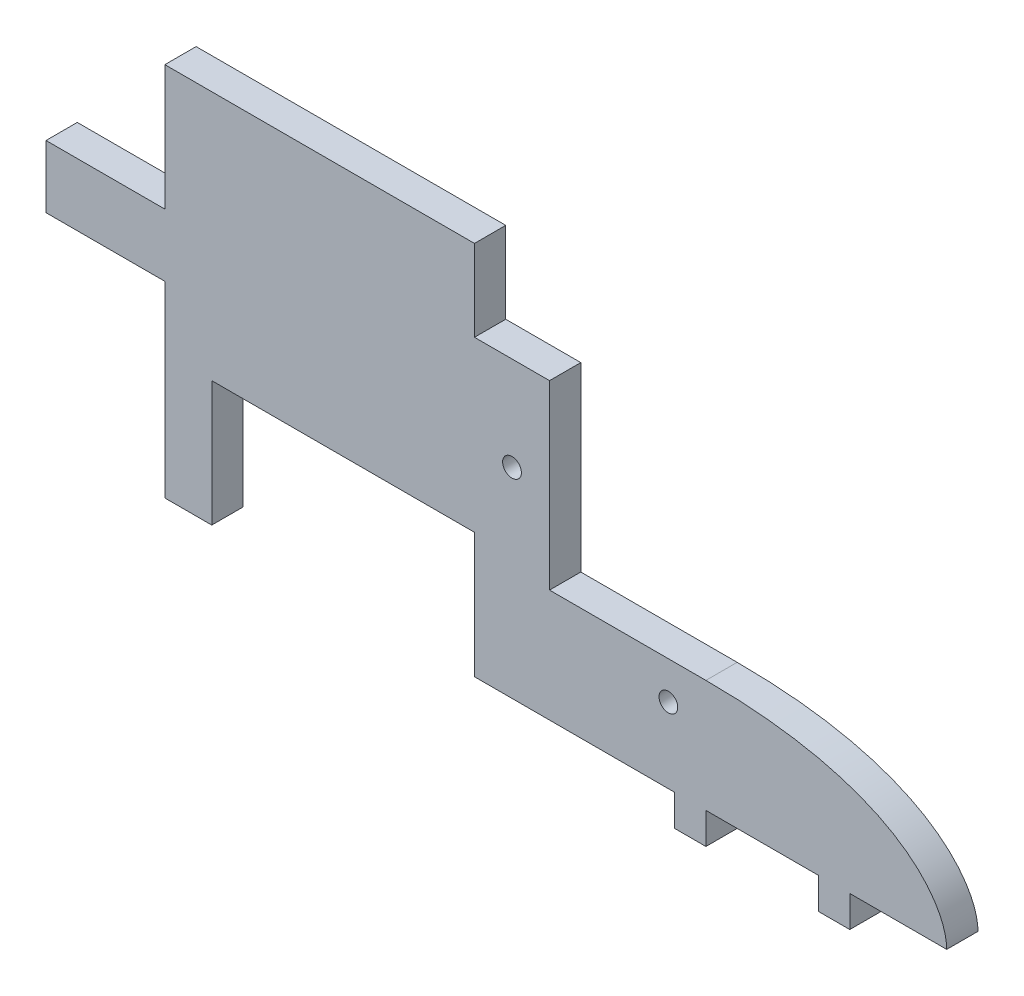
ISO-10303-21;
HEADER;
FILE_DESCRIPTION(('STEP AP214'),'2;1');
FILE_NAME('part.step','',(''),(''),'','','');
FILE_SCHEMA(('AUTOMOTIVE_DESIGN { 1 0 10303 214 1 1 1 1 }'));
ENDSEC;
DATA;
#1=APPLICATION_CONTEXT('core data for automotive mechanical design processes');
#2=APPLICATION_PROTOCOL_DEFINITION('international standard','automotive_design',2000,#1);
#3=PRODUCT_CONTEXT('',#1,'mechanical');
#4=PRODUCT('Part','Part','',(#3));
#5=PRODUCT_RELATED_PRODUCT_CATEGORY('part','',(#4));
#6=PRODUCT_DEFINITION_FORMATION('','',#4);
#7=PRODUCT_DEFINITION_CONTEXT('part definition',#1,'design');
#8=PRODUCT_DEFINITION('design','',#6,#7);
#9=PRODUCT_DEFINITION_SHAPE('','',#8);
#10=(LENGTH_UNIT() NAMED_UNIT(*) SI_UNIT(.MILLI.,.METRE.));
#11=(NAMED_UNIT(*) PLANE_ANGLE_UNIT() SI_UNIT($,.RADIAN.));
#12=(NAMED_UNIT(*) SI_UNIT($,.STERADIAN.) SOLID_ANGLE_UNIT());
#13=UNCERTAINTY_MEASURE_WITH_UNIT(LENGTH_MEASURE(1.E-05),#10,'distance_accuracy_value','');
#14=(GEOMETRIC_REPRESENTATION_CONTEXT(3) GLOBAL_UNCERTAINTY_ASSIGNED_CONTEXT((#13)) GLOBAL_UNIT_ASSIGNED_CONTEXT((#10,
#11,#12)) REPRESENTATION_CONTEXT('',''));
#15=CARTESIAN_POINT('',(0.,0.,0.));
#16=DIRECTION('',(0.,0.,1.));
#17=DIRECTION('',(1.,0.,0.));
#18=AXIS2_PLACEMENT_3D('',#15,#16,#17);
#19=CARTESIAN_POINT('',(0.,0.,5.));
#20=DIRECTION('',(0.,0.,-1.));
#21=DIRECTION('',(-1.,0.,0.));
#22=AXIS2_PLACEMENT_3D('',#19,#20,#21);
#23=PLANE('',#22);
#24=CARTESIAN_POINT('',(6.,32.,5.));
#25=DIRECTION('',(0.,0.,1.));
#26=DIRECTION('',(1.,0.,0.));
#27=AXIS2_PLACEMENT_3D('',#24,#25,#26);
#28=CIRCLE('',#27,1.5);
#29=CARTESIAN_POINT('',(7.5,32.,5.));
#30=VERTEX_POINT('',#29);
#31=EDGE_CURVE('E394',#30,#30,#28,.T.);
#32=ORIENTED_EDGE('',*,*,#31,.F.);
#33=EDGE_LOOP('',(#32));
#34=FACE_BOUND('',#33,.T.);
#35=DIRECTION('',(1.,0.,0.));
#36=VECTOR('',#35,1.);
#37=CARTESIAN_POINT('',(0.,60.,5.));
#38=LINE('',#37,#36);
#39=CARTESIAN_POINT('',(-49.5,60.,5.));
#40=VERTEX_POINT('',#39);
#41=CARTESIAN_POINT('',(0.,60.,5.));
#42=VERTEX_POINT('',#41);
#43=EDGE_CURVE('E195',#40,#42,#38,.T.);
#44=ORIENTED_EDGE('',*,*,#43,.F.);
#45=DIRECTION('',(0.,1.,0.));
#46=VECTOR('',#45,1.);
#47=CARTESIAN_POINT('',(-49.5,40.,5.));
#48=LINE('',#47,#46);
#49=CARTESIAN_POINT('',(-49.5,40.,5.));
#50=VERTEX_POINT('',#49);
#51=EDGE_CURVE('E199',#50,#40,#48,.T.);
#52=ORIENTED_EDGE('',*,*,#51,.F.);
#53=DIRECTION('',(1.,0.,0.));
#54=VECTOR('',#53,1.);
#55=CARTESIAN_POINT('',(-49.5,40.,5.));
#56=LINE('',#55,#54);
#57=CARTESIAN_POINT('',(-68.5,40.,5.));
#58=VERTEX_POINT('',#57);
#59=EDGE_CURVE('E212',#58,#50,#56,.T.);
#60=ORIENTED_EDGE('',*,*,#59,.F.);
#61=DIRECTION('',(0.,1.,0.));
#62=VECTOR('',#61,1.);
#63=CARTESIAN_POINT('',(-68.5,30.,5.));
#64=LINE('',#63,#62);
#65=CARTESIAN_POINT('',(-68.5,30.,5.));
#66=VERTEX_POINT('',#65);
#67=EDGE_CURVE('E216',#66,#58,#64,.T.);
#68=ORIENTED_EDGE('',*,*,#67,.F.);
#69=DIRECTION('',(-1.,0.,0.));
#70=VECTOR('',#69,1.);
#71=CARTESIAN_POINT('',(-49.5,30.,5.));
#72=LINE('',#71,#70);
#73=CARTESIAN_POINT('',(-49.5,30.,5.));
#74=VERTEX_POINT('',#73);
#75=EDGE_CURVE('E424',#74,#66,#72,.T.);
#76=ORIENTED_EDGE('',*,*,#75,.F.);
#77=DIRECTION('',(0.,1.,0.));
#78=VECTOR('',#77,1.);
#79=CARTESIAN_POINT('',(-49.5,0.,5.));
#80=LINE('',#79,#78);
#81=CARTESIAN_POINT('',(-49.5,0.,5.));
#82=VERTEX_POINT('',#81);
#83=EDGE_CURVE('E421',#82,#74,#80,.T.);
#84=ORIENTED_EDGE('',*,*,#83,.F.);
#85=DIRECTION('',(-1.,0.,0.));
#86=VECTOR('',#85,1.);
#87=CARTESIAN_POINT('',(-42.,0.,5.));
#88=LINE('',#87,#86);
#89=CARTESIAN_POINT('',(-42.,0.,5.));
#90=VERTEX_POINT('',#89);
#91=EDGE_CURVE('E415',#90,#82,#88,.T.);
#92=ORIENTED_EDGE('',*,*,#91,.F.);
#93=DIRECTION('',(0.,-1.,0.));
#94=VECTOR('',#93,1.);
#95=CARTESIAN_POINT('',(-42.,20.,5.));
#96=LINE('',#95,#94);
#97=CARTESIAN_POINT('',(-42.,20.,5.));
#98=VERTEX_POINT('',#97);
#99=EDGE_CURVE('E412',#98,#90,#96,.T.);
#100=ORIENTED_EDGE('',*,*,#99,.F.);
#101=DIRECTION('',(-1.,0.,0.));
#102=VECTOR('',#101,1.);
#103=CARTESIAN_POINT('',(0.,20.,5.));
#104=LINE('',#103,#102);
#105=CARTESIAN_POINT('',(0.,20.,5.));
#106=VERTEX_POINT('',#105);
#107=EDGE_CURVE('E409',#106,#98,#104,.T.);
#108=ORIENTED_EDGE('',*,*,#107,.F.);
#109=DIRECTION('',(0.,-1.,0.));
#110=VECTOR('',#109,1.);
#111=CARTESIAN_POINT('',(0.,0.,5.));
#112=LINE('',#111,#110);
#113=CARTESIAN_POINT('',(0.,0.,5.));
#114=VERTEX_POINT('',#113);
#115=EDGE_CURVE('E55',#106,#114,#112,.T.);
#116=ORIENTED_EDGE('',*,*,#115,.T.);
#117=DIRECTION('',(1.,0.,0.));
#118=VECTOR('',#117,1.);
#119=CARTESIAN_POINT('',(0.,0.,5.));
#120=LINE('',#119,#118);
#121=CARTESIAN_POINT('',(32.,0.,5.));
#122=VERTEX_POINT('',#121);
#123=EDGE_CURVE('E387',#114,#122,#120,.T.);
#124=ORIENTED_EDGE('',*,*,#123,.T.);
#125=DIRECTION('',(0.,-1.,0.));
#126=VECTOR('',#125,1.);
#127=CARTESIAN_POINT('',(32.,0.,5.));
#128=LINE('',#127,#126);
#129=CARTESIAN_POINT('',(32.,-5.,5.));
#130=VERTEX_POINT('',#129);
#131=EDGE_CURVE('E342',#122,#130,#128,.T.);
#132=ORIENTED_EDGE('',*,*,#131,.T.);
#133=DIRECTION('',(1.,0.,0.));
#134=VECTOR('',#133,1.);
#135=CARTESIAN_POINT('',(37.,-5.,5.));
#136=LINE('',#135,#134);
#137=CARTESIAN_POINT('',(37.,-5.,5.));
#138=VERTEX_POINT('',#137);
#139=EDGE_CURVE('E380',#130,#138,#136,.T.);
#140=ORIENTED_EDGE('',*,*,#139,.T.);
#141=DIRECTION('',(0.,1.,0.));
#142=VECTOR('',#141,1.);
#143=CARTESIAN_POINT('',(37.,0.,5.));
#144=LINE('',#143,#142);
#145=CARTESIAN_POINT('',(37.,0.,5.));
#146=VERTEX_POINT('',#145);
#147=EDGE_CURVE('E383',#138,#146,#144,.T.);
#148=ORIENTED_EDGE('',*,*,#147,.T.);
#149=DIRECTION('',(-1.,0.,0.));
#150=VECTOR('',#149,1.);
#151=CARTESIAN_POINT('',(37.,0.,5.));
#152=LINE('',#151,#150);
#153=CARTESIAN_POINT('',(55.,0.,5.));
#154=VERTEX_POINT('',#153);
#155=EDGE_CURVE('E529',#154,#146,#152,.T.);
#156=ORIENTED_EDGE('',*,*,#155,.F.);
#157=DIRECTION('',(0.,1.,0.));
#158=VECTOR('',#157,1.);
#159=CARTESIAN_POINT('',(55.,0.,5.));
#160=LINE('',#159,#158);
#161=CARTESIAN_POINT('',(55.,-4.99999999999995,5.));
#162=VERTEX_POINT('',#161);
#163=EDGE_CURVE('E536',#162,#154,#160,.T.);
#164=ORIENTED_EDGE('',*,*,#163,.F.);
#165=DIRECTION('',(-1.,0.,0.));
#166=VECTOR('',#165,1.);
#167=CARTESIAN_POINT('',(60.,-4.99999999999995,5.));
#168=LINE('',#167,#166);
#169=CARTESIAN_POINT('',(60.,-4.99999999999995,5.));
#170=VERTEX_POINT('',#169);
#171=EDGE_CURVE('E540',#170,#162,#168,.T.);
#172=ORIENTED_EDGE('',*,*,#171,.F.);
#173=DIRECTION('',(0.,-1.,0.));
#174=VECTOR('',#173,1.);
#175=CARTESIAN_POINT('',(60.,0.,5.));
#176=LINE('',#175,#174);
#177=CARTESIAN_POINT('',(60.,0.,5.));
#178=VERTEX_POINT('',#177);
#179=EDGE_CURVE('E544',#178,#170,#176,.T.);
#180=ORIENTED_EDGE('',*,*,#179,.F.);
#181=DIRECTION('',(-1.,0.,0.));
#182=VECTOR('',#181,1.);
#183=CARTESIAN_POINT('',(60.,0.,5.));
#184=LINE('',#183,#182);
#185=CARTESIAN_POINT('',(75.5,0.,5.));
#186=VERTEX_POINT('',#185);
#187=EDGE_CURVE('E267',#186,#178,#184,.T.);
#188=ORIENTED_EDGE('',*,*,#187,.F.);
#189=CARTESIAN_POINT('',(37.,18.,5.));
#190=CARTESIAN_POINT('',(67.6854096357002,18.,5.));
#191=CARTESIAN_POINT('',(75.5,5.98223252941199,5.));
#192=CARTESIAN_POINT('',(75.5,0.,5.));
#193=B_SPLINE_CURVE_WITH_KNOTS('',3,(#189,#190,#191,#192),.UNSPECIFIED.,.F.,.F.,(4,4),(0.,1.),.UNSPECIFIED.);
#194=CARTESIAN_POINT('',(37.,18.,5.));
#195=VERTEX_POINT('',#194);
#196=EDGE_CURVE('E261',#195,#186,#193,.T.);
#197=ORIENTED_EDGE('',*,*,#196,.F.);
#198=DIRECTION('',(-1.,0.,0.));
#199=VECTOR('',#198,1.);
#200=CARTESIAN_POINT('',(12.,18.,5.));
#201=LINE('',#200,#199);
#202=CARTESIAN_POINT('',(12.,18.,5.));
#203=VERTEX_POINT('',#202);
#204=EDGE_CURVE('E385',#195,#203,#201,.T.);
#205=ORIENTED_EDGE('',*,*,#204,.T.);
#206=DIRECTION('',(0.,1.,0.));
#207=VECTOR('',#206,1.);
#208=CARTESIAN_POINT('',(12.,47.,5.));
#209=LINE('',#208,#207);
#210=CARTESIAN_POINT('',(12.,47.,5.));
#211=VERTEX_POINT('',#210);
#212=EDGE_CURVE('E392',#203,#211,#209,.T.);
#213=ORIENTED_EDGE('',*,*,#212,.T.);
#214=DIRECTION('',(-1.,0.,0.));
#215=VECTOR('',#214,1.);
#216=CARTESIAN_POINT('',(0.,47.,5.));
#217=LINE('',#216,#215);
#218=CARTESIAN_POINT('',(0.,47.,5.));
#219=VERTEX_POINT('',#218);
#220=EDGE_CURVE('E366',#211,#219,#217,.T.);
#221=ORIENTED_EDGE('',*,*,#220,.T.);
#222=DIRECTION('',(0.,-1.,0.));
#223=VECTOR('',#222,1.);
#224=CARTESIAN_POINT('',(0.,20.,5.));
#225=LINE('',#224,#223);
#226=EDGE_CURVE('E202',#42,#219,#225,.T.);
#227=ORIENTED_EDGE('',*,*,#226,.F.);
#228=EDGE_LOOP('',(#44,#52,#60,#68,#76,#84,#92,#100,#108,#116,#124,#132,#140,#148,#156,#164,
#172,#180,#188,#197,#205,#213,#221,#227));
#229=FACE_BOUND('',#228,.T.);
#230=CARTESIAN_POINT('',(31.,12.,5.));
#231=DIRECTION('',(0.,0.,1.));
#232=DIRECTION('',(1.,0.,0.));
#233=AXIS2_PLACEMENT_3D('',#230,#231,#232);
#234=CIRCLE('',#233,1.5);
#235=CARTESIAN_POINT('',(32.5,12.,5.));
#236=VERTEX_POINT('',#235);
#237=EDGE_CURVE('E400',#236,#236,#234,.T.);
#238=ORIENTED_EDGE('',*,*,#237,.F.);
#239=EDGE_LOOP('',(#238));
#240=FACE_BOUND('',#239,.T.);
#241=ADVANCED_FACE('F33',(#34,#229,#240),#23,.F.);
#242=CARTESIAN_POINT('',(0.,0.,0.));
#243=DIRECTION('',(0.,0.,-1.));
#244=DIRECTION('',(-1.,0.,0.));
#245=AXIS2_PLACEMENT_3D('',#242,#243,#244);
#246=PLANE('',#245);
#247=DIRECTION('',(0.,1.,0.));
#248=VECTOR('',#247,1.);
#249=CARTESIAN_POINT('',(-49.5,40.,0.));
#250=LINE('',#249,#248);
#251=CARTESIAN_POINT('',(-49.5,40.,0.));
#252=VERTEX_POINT('',#251);
#253=CARTESIAN_POINT('',(-49.5,60.,0.));
#254=VERTEX_POINT('',#253);
#255=EDGE_CURVE('E203',#252,#254,#250,.T.);
#256=ORIENTED_EDGE('',*,*,#255,.T.);
#257=DIRECTION('',(1.,0.,0.));
#258=VECTOR('',#257,1.);
#259=CARTESIAN_POINT('',(0.,60.,0.));
#260=LINE('',#259,#258);
#261=CARTESIAN_POINT('',(0.,60.,0.));
#262=VERTEX_POINT('',#261);
#263=EDGE_CURVE('E47',#254,#262,#260,.T.);
#264=ORIENTED_EDGE('',*,*,#263,.T.);
#265=DIRECTION('',(0.,-1.,0.));
#266=VECTOR('',#265,1.);
#267=CARTESIAN_POINT('',(0.,20.,0.));
#268=LINE('',#267,#266);
#269=CARTESIAN_POINT('',(0.,47.,0.));
#270=VERTEX_POINT('',#269);
#271=EDGE_CURVE('E221',#262,#270,#268,.T.);
#272=ORIENTED_EDGE('',*,*,#271,.T.);
#273=DIRECTION('',(-1.,0.,0.));
#274=VECTOR('',#273,1.);
#275=CARTESIAN_POINT('',(0.,47.,0.));
#276=LINE('',#275,#274);
#277=CARTESIAN_POINT('',(12.,47.,0.));
#278=VERTEX_POINT('',#277);
#279=EDGE_CURVE('E360',#278,#270,#276,.T.);
#280=ORIENTED_EDGE('',*,*,#279,.F.);
#281=DIRECTION('',(0.,1.,0.));
#282=VECTOR('',#281,1.);
#283=CARTESIAN_POINT('',(12.,47.,0.));
#284=LINE('',#283,#282);
#285=CARTESIAN_POINT('',(12.,18.,0.));
#286=VERTEX_POINT('',#285);
#287=EDGE_CURVE('E358',#286,#278,#284,.T.);
#288=ORIENTED_EDGE('',*,*,#287,.F.);
#289=DIRECTION('',(-1.,0.,0.));
#290=VECTOR('',#289,1.);
#291=CARTESIAN_POINT('',(12.,18.,0.));
#292=LINE('',#291,#290);
#293=CARTESIAN_POINT('',(37.,18.,0.));
#294=VERTEX_POINT('',#293);
#295=EDGE_CURVE('E356',#294,#286,#292,.T.);
#296=ORIENTED_EDGE('',*,*,#295,.F.);
#297=CARTESIAN_POINT('',(37.,18.,0.));
#298=CARTESIAN_POINT('',(67.6854096357002,18.,0.));
#299=CARTESIAN_POINT('',(75.5,5.98223252941199,0.));
#300=CARTESIAN_POINT('',(75.5,0.,0.));
#301=B_SPLINE_CURVE_WITH_KNOTS('',3,(#297,#298,#299,#300),.UNSPECIFIED.,.F.,.F.,(4,4),(0.,1.),.UNSPECIFIED.);
#302=CARTESIAN_POINT('',(75.5,0.,0.));
#303=VERTEX_POINT('',#302);
#304=EDGE_CURVE('E247',#294,#303,#301,.T.);
#305=ORIENTED_EDGE('',*,*,#304,.T.);
#306=DIRECTION('',(-1.,0.,0.));
#307=VECTOR('',#306,1.);
#308=CARTESIAN_POINT('',(60.,0.,0.));
#309=LINE('',#308,#307);
#310=CARTESIAN_POINT('',(60.,0.,0.));
#311=VERTEX_POINT('',#310);
#312=EDGE_CURVE('E503',#303,#311,#309,.T.);
#313=ORIENTED_EDGE('',*,*,#312,.T.);
#314=DIRECTION('',(0.,-1.,0.));
#315=VECTOR('',#314,1.);
#316=CARTESIAN_POINT('',(60.,0.,0.));
#317=LINE('',#316,#315);
#318=CARTESIAN_POINT('',(60.,-4.99999999999995,0.));
#319=VERTEX_POINT('',#318);
#320=EDGE_CURVE('E494',#311,#319,#317,.T.);
#321=ORIENTED_EDGE('',*,*,#320,.T.);
#322=DIRECTION('',(-1.,0.,0.));
#323=VECTOR('',#322,1.);
#324=CARTESIAN_POINT('',(60.,-4.99999999999995,0.));
#325=LINE('',#324,#323);
#326=CARTESIAN_POINT('',(55.,-4.99999999999995,0.));
#327=VERTEX_POINT('',#326);
#328=EDGE_CURVE('E502',#319,#327,#325,.T.);
#329=ORIENTED_EDGE('',*,*,#328,.T.);
#330=DIRECTION('',(0.,1.,0.));
#331=VECTOR('',#330,1.);
#332=CARTESIAN_POINT('',(55.,0.,0.));
#333=LINE('',#332,#331);
#334=CARTESIAN_POINT('',(55.,0.,0.));
#335=VERTEX_POINT('',#334);
#336=EDGE_CURVE('E515',#327,#335,#333,.T.);
#337=ORIENTED_EDGE('',*,*,#336,.T.);
#338=DIRECTION('',(-1.,0.,0.));
#339=VECTOR('',#338,1.);
#340=CARTESIAN_POINT('',(37.,0.,0.));
#341=LINE('',#340,#339);
#342=CARTESIAN_POINT('',(37.,0.,0.));
#343=VERTEX_POINT('',#342);
#344=EDGE_CURVE('E268',#335,#343,#341,.T.);
#345=ORIENTED_EDGE('',*,*,#344,.T.);
#346=DIRECTION('',(0.,1.,0.));
#347=VECTOR('',#346,1.);
#348=CARTESIAN_POINT('',(37.,0.,0.));
#349=LINE('',#348,#347);
#350=CARTESIAN_POINT('',(37.,-5.,0.));
#351=VERTEX_POINT('',#350);
#352=EDGE_CURVE('E350',#351,#343,#349,.T.);
#353=ORIENTED_EDGE('',*,*,#352,.F.);
#354=DIRECTION('',(1.,0.,0.));
#355=VECTOR('',#354,1.);
#356=CARTESIAN_POINT('',(37.,-5.,0.));
#357=LINE('',#356,#355);
#358=CARTESIAN_POINT('',(32.,-5.,0.));
#359=VERTEX_POINT('',#358);
#360=EDGE_CURVE('E348',#359,#351,#357,.T.);
#361=ORIENTED_EDGE('',*,*,#360,.F.);
#362=DIRECTION('',(0.,-1.,0.));
#363=VECTOR('',#362,1.);
#364=CARTESIAN_POINT('',(32.,0.,0.));
#365=LINE('',#364,#363);
#366=CARTESIAN_POINT('',(32.,0.,0.));
#367=VERTEX_POINT('',#366);
#368=EDGE_CURVE('E337',#367,#359,#365,.T.);
#369=ORIENTED_EDGE('',*,*,#368,.F.);
#370=DIRECTION('',(1.,0.,0.));
#371=VECTOR('',#370,1.);
#372=CARTESIAN_POINT('',(0.,0.,0.));
#373=LINE('',#372,#371);
#374=CARTESIAN_POINT('',(0.,0.,0.));
#375=VERTEX_POINT('',#374);
#376=EDGE_CURVE('E330',#375,#367,#373,.T.);
#377=ORIENTED_EDGE('',*,*,#376,.F.);
#378=DIRECTION('',(0.,-1.,0.));
#379=VECTOR('',#378,1.);
#380=CARTESIAN_POINT('',(0.,0.,0.));
#381=LINE('',#380,#379);
#382=CARTESIAN_POINT('',(0.,20.,0.));
#383=VERTEX_POINT('',#382);
#384=EDGE_CURVE('E338',#383,#375,#381,.T.);
#385=ORIENTED_EDGE('',*,*,#384,.F.);
#386=DIRECTION('',(-1.,0.,0.));
#387=VECTOR('',#386,1.);
#388=CARTESIAN_POINT('',(0.,20.,0.));
#389=LINE('',#388,#387);
#390=CARTESIAN_POINT('',(-42.,20.,0.));
#391=VERTEX_POINT('',#390);
#392=EDGE_CURVE('E224',#383,#391,#389,.T.);
#393=ORIENTED_EDGE('',*,*,#392,.T.);
#394=DIRECTION('',(0.,-1.,0.));
#395=VECTOR('',#394,1.);
#396=CARTESIAN_POINT('',(-42.,20.,0.));
#397=LINE('',#396,#395);
#398=CARTESIAN_POINT('',(-42.,0.,0.));
#399=VERTEX_POINT('',#398);
#400=EDGE_CURVE('E227',#391,#399,#397,.T.);
#401=ORIENTED_EDGE('',*,*,#400,.T.);
#402=DIRECTION('',(-1.,0.,0.));
#403=VECTOR('',#402,1.);
#404=CARTESIAN_POINT('',(-42.,0.,0.));
#405=LINE('',#404,#403);
#406=CARTESIAN_POINT('',(-49.5,0.,0.));
#407=VERTEX_POINT('',#406);
#408=EDGE_CURVE('E230',#399,#407,#405,.T.);
#409=ORIENTED_EDGE('',*,*,#408,.T.);
#410=DIRECTION('',(0.,1.,0.));
#411=VECTOR('',#410,1.);
#412=CARTESIAN_POINT('',(-49.5,0.,0.));
#413=LINE('',#412,#411);
#414=CARTESIAN_POINT('',(-49.5,30.,0.));
#415=VERTEX_POINT('',#414);
#416=EDGE_CURVE('E233',#407,#415,#413,.T.);
#417=ORIENTED_EDGE('',*,*,#416,.T.);
#418=DIRECTION('',(-1.,0.,0.));
#419=VECTOR('',#418,1.);
#420=CARTESIAN_POINT('',(-49.5,30.,0.));
#421=LINE('',#420,#419);
#422=CARTESIAN_POINT('',(-68.5,30.,0.));
#423=VERTEX_POINT('',#422);
#424=EDGE_CURVE('E236',#415,#423,#421,.T.);
#425=ORIENTED_EDGE('',*,*,#424,.T.);
#426=DIRECTION('',(0.,1.,0.));
#427=VECTOR('',#426,1.);
#428=CARTESIAN_POINT('',(-68.5,30.,0.));
#429=LINE('',#428,#427);
#430=CARTESIAN_POINT('',(-68.5,40.,0.));
#431=VERTEX_POINT('',#430);
#432=EDGE_CURVE('E239',#423,#431,#429,.T.);
#433=ORIENTED_EDGE('',*,*,#432,.T.);
#434=DIRECTION('',(1.,0.,0.));
#435=VECTOR('',#434,1.);
#436=CARTESIAN_POINT('',(-49.5,40.,0.));
#437=LINE('',#436,#435);
#438=EDGE_CURVE('E242',#431,#252,#437,.T.);
#439=ORIENTED_EDGE('',*,*,#438,.T.);
#440=EDGE_LOOP('',(#256,#264,#272,#280,#288,#296,#305,#313,#321,#329,#337,#345,#353,#361,#369,
#377,#385,#393,#401,#409,#417,#425,#433,#439));
#441=FACE_BOUND('',#440,.T.);
#442=CARTESIAN_POINT('',(6.,32.,0.));
#443=DIRECTION('',(0.,0.,1.));
#444=DIRECTION('',(1.,0.,0.));
#445=AXIS2_PLACEMENT_3D('',#442,#443,#444);
#446=CIRCLE('',#445,1.5);
#447=CARTESIAN_POINT('',(7.5,32.,0.));
#448=VERTEX_POINT('',#447);
#449=EDGE_CURVE('E396',#448,#448,#446,.T.);
#450=ORIENTED_EDGE('',*,*,#449,.T.);
#451=EDGE_LOOP('',(#450));
#452=FACE_BOUND('',#451,.T.);
#453=CARTESIAN_POINT('',(31.,12.,0.));
#454=DIRECTION('',(0.,0.,1.));
#455=DIRECTION('',(1.,0.,0.));
#456=AXIS2_PLACEMENT_3D('',#453,#454,#455);
#457=CIRCLE('',#456,1.5);
#458=CARTESIAN_POINT('',(32.5,12.,0.));
#459=VERTEX_POINT('',#458);
#460=EDGE_CURVE('E403',#459,#459,#457,.T.);
#461=ORIENTED_EDGE('',*,*,#460,.T.);
#462=EDGE_LOOP('',(#461));
#463=FACE_BOUND('',#462,.T.);
#464=ADVANCED_FACE('F294',(#441,#452,#463),#246,.T.);
#465=CARTESIAN_POINT('',(0.,0.,5.));
#466=DIRECTION('',(1.,0.,0.));
#467=DIRECTION('',(0.,0.,-1.));
#468=AXIS2_PLACEMENT_3D('',#465,#466,#467);
#469=PLANE('',#468);
#470=ORIENTED_EDGE('',*,*,#115,.F.);
#471=DIRECTION('',(0.,0.,-1.));
#472=VECTOR('',#471,1.);
#473=CARTESIAN_POINT('',(0.,20.,5.));
#474=LINE('',#473,#472);
#475=EDGE_CURVE('E214',#106,#383,#474,.T.);
#476=ORIENTED_EDGE('',*,*,#475,.T.);
#477=ORIENTED_EDGE('',*,*,#384,.T.);
#478=DIRECTION('',(0.,0.,-1.));
#479=VECTOR('',#478,1.);
#480=CARTESIAN_POINT('',(0.,0.,5.));
#481=LINE('',#480,#479);
#482=EDGE_CURVE('E41',#114,#375,#481,.T.);
#483=ORIENTED_EDGE('',*,*,#482,.F.);
#484=EDGE_LOOP('',(#470,#476,#477,#483));
#485=FACE_BOUND('',#484,.T.);
#486=ADVANCED_FACE('F35',(#485),#469,.F.);
#487=CARTESIAN_POINT('',(0.,0.,5.));
#488=DIRECTION('',(0.,1.,0.));
#489=DIRECTION('',(-1.,0.,0.));
#490=AXIS2_PLACEMENT_3D('',#487,#488,#489);
#491=PLANE('',#490);
#492=ORIENTED_EDGE('',*,*,#376,.T.);
#493=DIRECTION('',(0.,0.,-1.));
#494=VECTOR('',#493,1.);
#495=CARTESIAN_POINT('',(32.,0.,5.));
#496=LINE('',#495,#494);
#497=EDGE_CURVE('E333',#122,#367,#496,.T.);
#498=ORIENTED_EDGE('',*,*,#497,.F.);
#499=ORIENTED_EDGE('',*,*,#123,.F.);
#500=ORIENTED_EDGE('',*,*,#482,.T.);
#501=EDGE_LOOP('',(#492,#498,#499,#500));
#502=FACE_BOUND('',#501,.T.);
#503=ADVANCED_FACE('F320',(#502),#491,.F.);
#504=CARTESIAN_POINT('',(32.,0.,5.));
#505=DIRECTION('',(1.,0.,0.));
#506=DIRECTION('',(0.,0.,-1.));
#507=AXIS2_PLACEMENT_3D('',#504,#505,#506);
#508=PLANE('',#507);
#509=ORIENTED_EDGE('',*,*,#368,.T.);
#510=DIRECTION('',(0.,0.,-1.));
#511=VECTOR('',#510,1.);
#512=CARTESIAN_POINT('',(32.,-5.,5.));
#513=LINE('',#512,#511);
#514=EDGE_CURVE('E343',#130,#359,#513,.T.);
#515=ORIENTED_EDGE('',*,*,#514,.F.);
#516=ORIENTED_EDGE('',*,*,#131,.F.);
#517=ORIENTED_EDGE('',*,*,#497,.T.);
#518=EDGE_LOOP('',(#509,#515,#516,#517));
#519=FACE_BOUND('',#518,.T.);
#520=ADVANCED_FACE('F317',(#519),#508,.F.);
#521=CARTESIAN_POINT('',(37.,-5.,5.));
#522=DIRECTION('',(0.,1.,0.));
#523=DIRECTION('',(-1.,0.,0.));
#524=AXIS2_PLACEMENT_3D('',#521,#522,#523);
#525=PLANE('',#524);
#526=ORIENTED_EDGE('',*,*,#360,.T.);
#527=DIRECTION('',(0.,0.,-1.));
#528=VECTOR('',#527,1.);
#529=CARTESIAN_POINT('',(37.,-5.,5.));
#530=LINE('',#529,#528);
#531=EDGE_CURVE('E375',#138,#351,#530,.T.);
#532=ORIENTED_EDGE('',*,*,#531,.F.);
#533=ORIENTED_EDGE('',*,*,#139,.F.);
#534=ORIENTED_EDGE('',*,*,#514,.T.);
#535=EDGE_LOOP('',(#526,#532,#533,#534));
#536=FACE_BOUND('',#535,.T.);
#537=ADVANCED_FACE('F313',(#536),#525,.F.);
#538=CARTESIAN_POINT('',(37.,0.,5.));
#539=DIRECTION('',(-1.,0.,0.));
#540=DIRECTION('',(0.,0.,1.));
#541=AXIS2_PLACEMENT_3D('',#538,#539,#540);
#542=PLANE('',#541);
#543=ORIENTED_EDGE('',*,*,#352,.T.);
#544=DIRECTION('',(0.,0.,-1.));
#545=VECTOR('',#544,1.);
#546=CARTESIAN_POINT('',(37.,0.,5.));
#547=LINE('',#546,#545);
#548=EDGE_CURVE('E520',#146,#343,#547,.T.);
#549=ORIENTED_EDGE('',*,*,#548,.F.);
#550=ORIENTED_EDGE('',*,*,#147,.F.);
#551=ORIENTED_EDGE('',*,*,#531,.T.);
#552=EDGE_LOOP('',(#543,#549,#550,#551));
#553=FACE_BOUND('',#552,.T.);
#554=ADVANCED_FACE('F309',(#553),#542,.F.);
#555=CARTESIAN_POINT('',(12.,18.,5.));
#556=DIRECTION('',(0.,-1.,0.));
#557=DIRECTION('',(0.,0.,-1.));
#558=AXIS2_PLACEMENT_3D('',#555,#556,#557);
#559=PLANE('',#558);
#560=ORIENTED_EDGE('',*,*,#295,.T.);
#561=DIRECTION('',(0.,0.,-1.));
#562=VECTOR('',#561,1.);
#563=CARTESIAN_POINT('',(12.,18.,5.));
#564=LINE('',#563,#562);
#565=EDGE_CURVE('E369',#203,#286,#564,.T.);
#566=ORIENTED_EDGE('',*,*,#565,.F.);
#567=ORIENTED_EDGE('',*,*,#204,.F.);
#568=DIRECTION('',(0.,0.,-1.));
#569=VECTOR('',#568,1.);
#570=CARTESIAN_POINT('',(37.,18.,5.));
#571=LINE('',#570,#569);
#572=EDGE_CURVE('E372',#195,#294,#571,.T.);
#573=ORIENTED_EDGE('',*,*,#572,.T.);
#574=EDGE_LOOP('',(#560,#566,#567,#573));
#575=FACE_BOUND('',#574,.T.);
#576=ADVANCED_FACE('F305',(#575),#559,.F.);
#577=CARTESIAN_POINT('',(12.,47.,5.));
#578=DIRECTION('',(-1.,0.,0.));
#579=DIRECTION('',(0.,-1.,0.));
#580=AXIS2_PLACEMENT_3D('',#577,#578,#579);
#581=PLANE('',#580);
#582=ORIENTED_EDGE('',*,*,#287,.T.);
#583=DIRECTION('',(0.,0.,-1.));
#584=VECTOR('',#583,1.);
#585=CARTESIAN_POINT('',(12.,47.,5.));
#586=LINE('',#585,#584);
#587=EDGE_CURVE('E365',#211,#278,#586,.T.);
#588=ORIENTED_EDGE('',*,*,#587,.F.);
#589=ORIENTED_EDGE('',*,*,#212,.F.);
#590=ORIENTED_EDGE('',*,*,#565,.T.);
#591=EDGE_LOOP('',(#582,#588,#589,#590));
#592=FACE_BOUND('',#591,.T.);
#593=ADVANCED_FACE('F301',(#592),#581,.F.);
#594=CARTESIAN_POINT('',(0.,47.,5.));
#595=DIRECTION('',(0.,-1.,0.));
#596=DIRECTION('',(0.,0.,-1.));
#597=AXIS2_PLACEMENT_3D('',#594,#595,#596);
#598=PLANE('',#597);
#599=ORIENTED_EDGE('',*,*,#279,.T.);
#600=DIRECTION('',(0.,0.,-1.));
#601=VECTOR('',#600,1.);
#602=CARTESIAN_POINT('',(0.,47.,5.));
#603=LINE('',#602,#601);
#604=EDGE_CURVE('E362',#219,#270,#603,.T.);
#605=ORIENTED_EDGE('',*,*,#604,.F.);
#606=ORIENTED_EDGE('',*,*,#220,.F.);
#607=ORIENTED_EDGE('',*,*,#587,.T.);
#608=EDGE_LOOP('',(#599,#605,#606,#607));
#609=FACE_BOUND('',#608,.T.);
#610=ADVANCED_FACE('F290',(#609),#598,.F.);
#611=CARTESIAN_POINT('',(6.,32.,5.));
#612=DIRECTION('',(0.,0.,-1.));
#613=DIRECTION('',(-1.,0.,0.));
#614=AXIS2_PLACEMENT_3D('',#611,#612,#613);
#615=CYLINDRICAL_SURFACE('',#614,1.5);
#616=ORIENTED_EDGE('',*,*,#31,.T.);
#617=EDGE_LOOP('',(#616));
#618=FACE_BOUND('',#617,.T.);
#619=ORIENTED_EDGE('',*,*,#449,.F.);
#620=EDGE_LOOP('',(#619));
#621=FACE_BOUND('',#620,.T.);
#622=ADVANCED_FACE('F286',(#618,#621),#615,.F.);
#623=CARTESIAN_POINT('',(31.,12.,5.));
#624=DIRECTION('',(0.,0.,-1.));
#625=DIRECTION('',(-1.,0.,0.));
#626=AXIS2_PLACEMENT_3D('',#623,#624,#625);
#627=CYLINDRICAL_SURFACE('',#626,1.5);
#628=ORIENTED_EDGE('',*,*,#237,.T.);
#629=EDGE_LOOP('',(#628));
#630=FACE_BOUND('',#629,.T.);
#631=ORIENTED_EDGE('',*,*,#460,.F.);
#632=EDGE_LOOP('',(#631));
#633=FACE_BOUND('',#632,.T.);
#634=ADVANCED_FACE('F282',(#630,#633),#627,.F.);
#635=CARTESIAN_POINT('',(37.,0.,5.));
#636=DIRECTION('',(0.,-1.,0.));
#637=DIRECTION('',(1.,0.,0.));
#638=AXIS2_PLACEMENT_3D('',#635,#636,#637);
#639=PLANE('',#638);
#640=ORIENTED_EDGE('',*,*,#344,.F.);
#641=DIRECTION('',(0.,0.,-1.));
#642=VECTOR('',#641,1.);
#643=CARTESIAN_POINT('',(55.,0.,5.));
#644=LINE('',#643,#642);
#645=EDGE_CURVE('E522',#154,#335,#644,.T.);
#646=ORIENTED_EDGE('',*,*,#645,.F.);
#647=ORIENTED_EDGE('',*,*,#155,.T.);
#648=ORIENTED_EDGE('',*,*,#548,.T.);
#649=EDGE_LOOP('',(#640,#646,#647,#648));
#650=FACE_BOUND('',#649,.T.);
#651=ADVANCED_FACE('F285',(#650),#639,.T.);
#652=CARTESIAN_POINT('',(55.,0.,5.));
#653=DIRECTION('',(-1.,0.,0.));
#654=DIRECTION('',(0.,0.,1.));
#655=AXIS2_PLACEMENT_3D('',#652,#653,#654);
#656=PLANE('',#655);
#657=ORIENTED_EDGE('',*,*,#336,.F.);
#658=DIRECTION('',(0.,0.,-1.));
#659=VECTOR('',#658,1.);
#660=CARTESIAN_POINT('',(55.,-4.99999999999995,5.));
#661=LINE('',#660,#659);
#662=EDGE_CURVE('E524',#162,#327,#661,.T.);
#663=ORIENTED_EDGE('',*,*,#662,.F.);
#664=ORIENTED_EDGE('',*,*,#163,.T.);
#665=ORIENTED_EDGE('',*,*,#645,.T.);
#666=EDGE_LOOP('',(#657,#663,#664,#665));
#667=FACE_BOUND('',#666,.T.);
#668=ADVANCED_FACE('F477',(#667),#656,.T.);
#669=CARTESIAN_POINT('',(60.,-4.99999999999995,5.));
#670=DIRECTION('',(0.,-1.,0.));
#671=DIRECTION('',(0.,0.,-1.));
#672=AXIS2_PLACEMENT_3D('',#669,#670,#671);
#673=PLANE('',#672);
#674=ORIENTED_EDGE('',*,*,#328,.F.);
#675=DIRECTION('',(0.,0.,-1.));
#676=VECTOR('',#675,1.);
#677=CARTESIAN_POINT('',(60.,-4.99999999999995,5.));
#678=LINE('',#677,#676);
#679=EDGE_CURVE('E499',#170,#319,#678,.T.);
#680=ORIENTED_EDGE('',*,*,#679,.F.);
#681=ORIENTED_EDGE('',*,*,#171,.T.);
#682=ORIENTED_EDGE('',*,*,#662,.T.);
#683=EDGE_LOOP('',(#674,#680,#681,#682));
#684=FACE_BOUND('',#683,.T.);
#685=ADVANCED_FACE('F481',(#684),#673,.T.);
#686=CARTESIAN_POINT('',(60.,0.,5.));
#687=DIRECTION('',(1.,0.,0.));
#688=DIRECTION('',(0.,0.,-1.));
#689=AXIS2_PLACEMENT_3D('',#686,#687,#688);
#690=PLANE('',#689);
#691=ORIENTED_EDGE('',*,*,#320,.F.);
#692=DIRECTION('',(0.,0.,-1.));
#693=VECTOR('',#692,1.);
#694=CARTESIAN_POINT('',(60.,0.,5.));
#695=LINE('',#694,#693);
#696=EDGE_CURVE('E497',#178,#311,#695,.T.);
#697=ORIENTED_EDGE('',*,*,#696,.F.);
#698=ORIENTED_EDGE('',*,*,#179,.T.);
#699=ORIENTED_EDGE('',*,*,#679,.T.);
#700=EDGE_LOOP('',(#691,#697,#698,#699));
#701=FACE_BOUND('',#700,.T.);
#702=ADVANCED_FACE('F484',(#701),#690,.T.);
#703=CARTESIAN_POINT('',(60.,0.,5.));
#704=DIRECTION('',(0.,-1.,0.));
#705=DIRECTION('',(1.,0.,0.));
#706=AXIS2_PLACEMENT_3D('',#703,#704,#705);
#707=PLANE('',#706);
#708=ORIENTED_EDGE('',*,*,#312,.F.);
#709=DIRECTION('',(0.,0.,-1.));
#710=VECTOR('',#709,1.);
#711=CARTESIAN_POINT('',(75.5,0.,5.));
#712=LINE('',#711,#710);
#713=EDGE_CURVE('E528',#186,#303,#712,.T.);
#714=ORIENTED_EDGE('',*,*,#713,.F.);
#715=ORIENTED_EDGE('',*,*,#187,.T.);
#716=ORIENTED_EDGE('',*,*,#696,.T.);
#717=EDGE_LOOP('',(#708,#714,#715,#716));
#718=FACE_BOUND('',#717,.T.);
#719=ADVANCED_FACE('F279',(#718),#707,.T.);
#720=DIRECTION('',(0.,0.,-1.));
#721=VECTOR('',#720,1.);
#722=SURFACE_OF_LINEAR_EXTRUSION('',#193,#721);
#723=ORIENTED_EDGE('',*,*,#304,.F.);
#724=ORIENTED_EDGE('',*,*,#572,.F.);
#725=ORIENTED_EDGE('',*,*,#196,.T.);
#726=ORIENTED_EDGE('',*,*,#713,.T.);
#727=EDGE_LOOP('',(#723,#724,#725,#726));
#728=FACE_BOUND('',#727,.T.);
#729=ADVANCED_FACE('F274',(#728),#722,.T.);
#730=CARTESIAN_POINT('',(0.,20.,5.));
#731=DIRECTION('',(1.,0.,0.));
#732=DIRECTION('',(0.,1.,0.));
#733=AXIS2_PLACEMENT_3D('',#730,#731,#732);
#734=PLANE('',#733);
#735=ORIENTED_EDGE('',*,*,#604,.T.);
#736=ORIENTED_EDGE('',*,*,#271,.F.);
#737=DIRECTION('',(0.,0.,-1.));
#738=VECTOR('',#737,1.);
#739=CARTESIAN_POINT('',(0.,60.,5.));
#740=LINE('',#739,#738);
#741=EDGE_CURVE('E211',#42,#262,#740,.T.);
#742=ORIENTED_EDGE('',*,*,#741,.F.);
#743=ORIENTED_EDGE('',*,*,#226,.T.);
#744=EDGE_LOOP('',(#735,#736,#742,#743));
#745=FACE_BOUND('',#744,.T.);
#746=ADVANCED_FACE('F278',(#745),#734,.T.);
#747=CARTESIAN_POINT('',(-49.5,40.,5.));
#748=DIRECTION('',(-1.,0.,0.));
#749=DIRECTION('',(0.,0.,1.));
#750=AXIS2_PLACEMENT_3D('',#747,#748,#749);
#751=PLANE('',#750);
#752=DIRECTION('',(0.,0.,1.));
#753=VECTOR('',#752,1.);
#754=CARTESIAN_POINT('',(-49.5,60.,5.));
#755=LINE('',#754,#753);
#756=EDGE_CURVE('E11',#254,#40,#755,.T.);
#757=ORIENTED_EDGE('',*,*,#756,.F.);
#758=ORIENTED_EDGE('',*,*,#255,.F.);
#759=DIRECTION('',(0.,0.,-1.));
#760=VECTOR('',#759,1.);
#761=CARTESIAN_POINT('',(-49.5,40.,5.));
#762=LINE('',#761,#760);
#763=EDGE_CURVE('E210',#50,#252,#762,.T.);
#764=ORIENTED_EDGE('',*,*,#763,.F.);
#765=ORIENTED_EDGE('',*,*,#51,.T.);
#766=EDGE_LOOP('',(#757,#758,#764,#765));
#767=FACE_BOUND('',#766,.T.);
#768=ADVANCED_FACE('F209',(#767),#751,.T.);
#769=CARTESIAN_POINT('',(-49.5,40.,5.));
#770=DIRECTION('',(0.,1.,0.));
#771=DIRECTION('',(0.,0.,1.));
#772=AXIS2_PLACEMENT_3D('',#769,#770,#771);
#773=PLANE('',#772);
#774=ORIENTED_EDGE('',*,*,#438,.F.);
#775=DIRECTION('',(0.,0.,-1.));
#776=VECTOR('',#775,1.);
#777=CARTESIAN_POINT('',(-68.5,40.,5.));
#778=LINE('',#777,#776);
#779=EDGE_CURVE('E248',#58,#431,#778,.T.);
#780=ORIENTED_EDGE('',*,*,#779,.F.);
#781=ORIENTED_EDGE('',*,*,#59,.T.);
#782=ORIENTED_EDGE('',*,*,#763,.T.);
#783=EDGE_LOOP('',(#774,#780,#781,#782));
#784=FACE_BOUND('',#783,.T.);
#785=ADVANCED_FACE('F449',(#784),#773,.T.);
#786=CARTESIAN_POINT('',(-68.5,30.,5.));
#787=DIRECTION('',(-1.,0.,0.));
#788=DIRECTION('',(0.,0.,1.));
#789=AXIS2_PLACEMENT_3D('',#786,#787,#788);
#790=PLANE('',#789);
#791=ORIENTED_EDGE('',*,*,#432,.F.);
#792=DIRECTION('',(0.,0.,-1.));
#793=VECTOR('',#792,1.);
#794=CARTESIAN_POINT('',(-68.5,30.,5.));
#795=LINE('',#794,#793);
#796=EDGE_CURVE('E250',#66,#423,#795,.T.);
#797=ORIENTED_EDGE('',*,*,#796,.F.);
#798=ORIENTED_EDGE('',*,*,#67,.T.);
#799=ORIENTED_EDGE('',*,*,#779,.T.);
#800=EDGE_LOOP('',(#791,#797,#798,#799));
#801=FACE_BOUND('',#800,.T.);
#802=ADVANCED_FACE('F430',(#801),#790,.T.);
#803=CARTESIAN_POINT('',(-49.5,30.,5.));
#804=DIRECTION('',(0.,-1.,0.));
#805=DIRECTION('',(1.,0.,0.));
#806=AXIS2_PLACEMENT_3D('',#803,#804,#805);
#807=PLANE('',#806);
#808=ORIENTED_EDGE('',*,*,#424,.F.);
#809=DIRECTION('',(0.,0.,-1.));
#810=VECTOR('',#809,1.);
#811=CARTESIAN_POINT('',(-49.5,30.,5.));
#812=LINE('',#811,#810);
#813=EDGE_CURVE('E252',#74,#415,#812,.T.);
#814=ORIENTED_EDGE('',*,*,#813,.F.);
#815=ORIENTED_EDGE('',*,*,#75,.T.);
#816=ORIENTED_EDGE('',*,*,#796,.T.);
#817=EDGE_LOOP('',(#808,#814,#815,#816));
#818=FACE_BOUND('',#817,.T.);
#819=ADVANCED_FACE('F436',(#818),#807,.T.);
#820=CARTESIAN_POINT('',(-49.5,0.,5.));
#821=DIRECTION('',(-1.,0.,0.));
#822=DIRECTION('',(0.,0.,1.));
#823=AXIS2_PLACEMENT_3D('',#820,#821,#822);
#824=PLANE('',#823);
#825=ORIENTED_EDGE('',*,*,#416,.F.);
#826=DIRECTION('',(0.,0.,-1.));
#827=VECTOR('',#826,1.);
#828=CARTESIAN_POINT('',(-49.5,0.,5.));
#829=LINE('',#828,#827);
#830=EDGE_CURVE('E254',#82,#407,#829,.T.);
#831=ORIENTED_EDGE('',*,*,#830,.F.);
#832=ORIENTED_EDGE('',*,*,#83,.T.);
#833=ORIENTED_EDGE('',*,*,#813,.T.);
#834=EDGE_LOOP('',(#825,#831,#832,#833));
#835=FACE_BOUND('',#834,.T.);
#836=ADVANCED_FACE('F439',(#835),#824,.T.);
#837=CARTESIAN_POINT('',(-42.,0.,5.));
#838=DIRECTION('',(0.,-1.,0.));
#839=DIRECTION('',(1.,0.,0.));
#840=AXIS2_PLACEMENT_3D('',#837,#838,#839);
#841=PLANE('',#840);
#842=ORIENTED_EDGE('',*,*,#408,.F.);
#843=DIRECTION('',(0.,0.,-1.));
#844=VECTOR('',#843,1.);
#845=CARTESIAN_POINT('',(-42.,0.,5.));
#846=LINE('',#845,#844);
#847=EDGE_CURVE('E256',#90,#399,#846,.T.);
#848=ORIENTED_EDGE('',*,*,#847,.F.);
#849=ORIENTED_EDGE('',*,*,#91,.T.);
#850=ORIENTED_EDGE('',*,*,#830,.T.);
#851=EDGE_LOOP('',(#842,#848,#849,#850));
#852=FACE_BOUND('',#851,.T.);
#853=ADVANCED_FACE('F442',(#852),#841,.T.);
#854=CARTESIAN_POINT('',(-42.,20.,5.));
#855=DIRECTION('',(1.,0.,0.));
#856=DIRECTION('',(0.,1.,0.));
#857=AXIS2_PLACEMENT_3D('',#854,#855,#856);
#858=PLANE('',#857);
#859=ORIENTED_EDGE('',*,*,#400,.F.);
#860=DIRECTION('',(0.,0.,-1.));
#861=VECTOR('',#860,1.);
#862=CARTESIAN_POINT('',(-42.,20.,5.));
#863=LINE('',#862,#861);
#864=EDGE_CURVE('E258',#98,#391,#863,.T.);
#865=ORIENTED_EDGE('',*,*,#864,.F.);
#866=ORIENTED_EDGE('',*,*,#99,.T.);
#867=ORIENTED_EDGE('',*,*,#847,.T.);
#868=EDGE_LOOP('',(#859,#865,#866,#867));
#869=FACE_BOUND('',#868,.T.);
#870=ADVANCED_FACE('F445',(#869),#858,.T.);
#871=CARTESIAN_POINT('',(0.,20.,5.));
#872=DIRECTION('',(0.,-1.,0.));
#873=DIRECTION('',(1.,0.,0.));
#874=AXIS2_PLACEMENT_3D('',#871,#872,#873);
#875=PLANE('',#874);
#876=ORIENTED_EDGE('',*,*,#392,.F.);
#877=ORIENTED_EDGE('',*,*,#475,.F.);
#878=ORIENTED_EDGE('',*,*,#107,.T.);
#879=ORIENTED_EDGE('',*,*,#864,.T.);
#880=EDGE_LOOP('',(#876,#877,#878,#879));
#881=FACE_BOUND('',#880,.T.);
#882=ADVANCED_FACE('F447',(#881),#875,.T.);
#883=CARTESIAN_POINT('',(0.,60.,5.));
#884=DIRECTION('',(0.,1.,0.));
#885=DIRECTION('',(0.,0.,1.));
#886=AXIS2_PLACEMENT_3D('',#883,#884,#885);
#887=PLANE('',#886);
#888=ORIENTED_EDGE('',*,*,#263,.F.);
#889=ORIENTED_EDGE('',*,*,#756,.T.);
#890=ORIENTED_EDGE('',*,*,#43,.T.);
#891=ORIENTED_EDGE('',*,*,#741,.T.);
#892=EDGE_LOOP('',(#888,#889,#890,#891));
#893=FACE_BOUND('',#892,.T.);
#894=ADVANCED_FACE('F205',(#893),#887,.T.);
#895=CLOSED_SHELL('',(#241,#464,#486,#503,#520,#537,#554,#576,#593,#610,#622,#634,#651,#668,
#685,#702,#719,#729,#746,#768,#785,#802,#819,#836,#853,#870,#882,#894));
#896=MANIFOLD_SOLID_BREP('B2',#895);
#897=ADVANCED_BREP_SHAPE_REPRESENTATION('',(#18,#896),#14);
#898=SHAPE_DEFINITION_REPRESENTATION(#9,#897);
ENDSEC;
END-ISO-10303-21;
